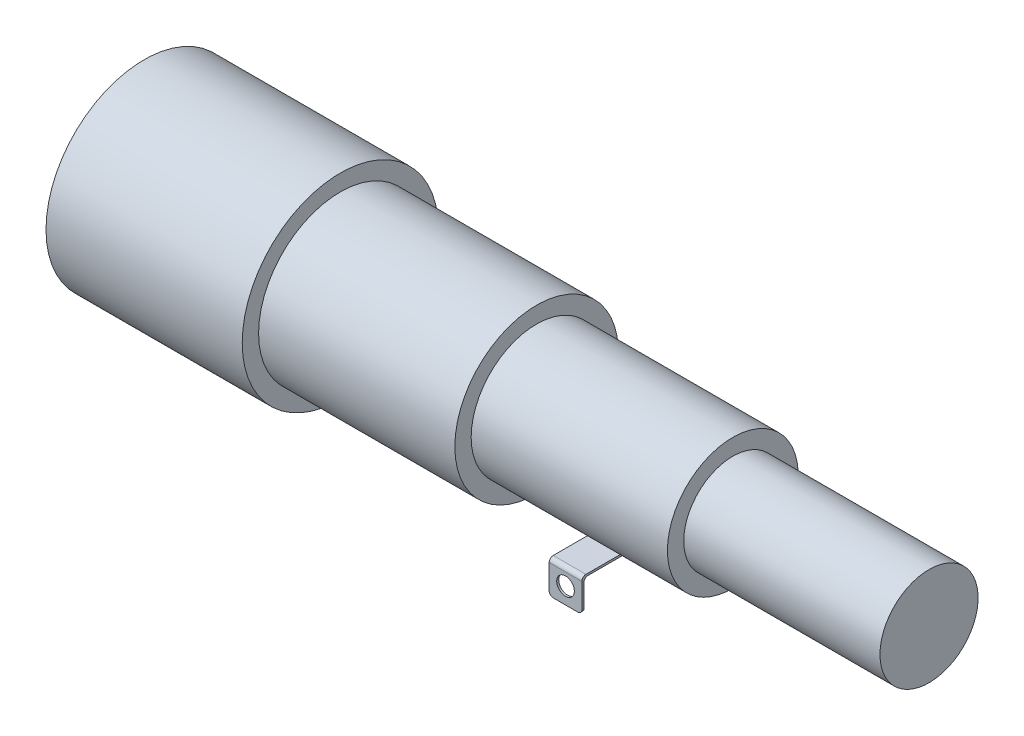
ISO-10303-21;
HEADER;
FILE_DESCRIPTION(('STEP AP214'),'2;1');
FILE_NAME('part.step','',(''),(''),'','','');
FILE_SCHEMA(('AUTOMOTIVE_DESIGN { 1 0 10303 214 1 1 1 1 }'));
ENDSEC;
DATA;
#1=APPLICATION_CONTEXT('core data for automotive mechanical design processes');
#2=APPLICATION_PROTOCOL_DEFINITION('international standard','automotive_design',2000,#1);
#3=PRODUCT_CONTEXT('',#1,'mechanical');
#4=PRODUCT('Part','Part','',(#3));
#5=PRODUCT_RELATED_PRODUCT_CATEGORY('part','',(#4));
#6=PRODUCT_DEFINITION_FORMATION('','',#4);
#7=PRODUCT_DEFINITION_CONTEXT('part definition',#1,'design');
#8=PRODUCT_DEFINITION('design','',#6,#7);
#9=PRODUCT_DEFINITION_SHAPE('','',#8);
#10=(LENGTH_UNIT() NAMED_UNIT(*) SI_UNIT(.MILLI.,.METRE.));
#11=(NAMED_UNIT(*) PLANE_ANGLE_UNIT() SI_UNIT($,.RADIAN.));
#12=(NAMED_UNIT(*) SI_UNIT($,.STERADIAN.) SOLID_ANGLE_UNIT());
#13=UNCERTAINTY_MEASURE_WITH_UNIT(LENGTH_MEASURE(1.E-05),#10,'distance_accuracy_value','');
#14=(GEOMETRIC_REPRESENTATION_CONTEXT(3) GLOBAL_UNCERTAINTY_ASSIGNED_CONTEXT((#13)) GLOBAL_UNIT_ASSIGNED_CONTEXT((#10,
#11,#12)) REPRESENTATION_CONTEXT('',''));
#15=CARTESIAN_POINT('',(0.,0.,0.));
#16=DIRECTION('',(0.,0.,1.));
#17=DIRECTION('',(1.,0.,0.));
#18=AXIS2_PLACEMENT_3D('',#15,#16,#17);
#19=CARTESIAN_POINT('',(730.633019333322,-104.775,98.298));
#20=DIRECTION('',(0.,0.,1.));
#21=DIRECTION('',(0.,-1.,0.));
#22=AXIS2_PLACEMENT_3D('',#19,#20,#21);
#23=PLANE('',#22);
#24=CARTESIAN_POINT('',(756.033019333322,-127.,98.2979999999999));
#25=DIRECTION('',(0.,0.,1.));
#26=DIRECTION('',(0.,-1.,0.));
#27=AXIS2_PLACEMENT_3D('',#24,#25,#26);
#28=CIRCLE('',#27,13.716);
#29=CARTESIAN_POINT('',(756.033019333322,-140.716,98.2979999999999));
#30=VERTEX_POINT('',#29);
#31=EDGE_CURVE('E292',#30,#30,#28,.T.);
#32=ORIENTED_EDGE('',*,*,#31,.T.);
#33=EDGE_LOOP('',(#32));
#34=FACE_BOUND('',#33,.T.);
#35=DIRECTION('',(0.,-1.,0.));
#36=VECTOR('',#35,1.);
#37=CARTESIAN_POINT('',(781.433019333322,-104.775,98.298));
#38=LINE('',#37,#36);
#39=CARTESIAN_POINT('',(781.433019333322,-111.125,98.298));
#40=VERTEX_POINT('',#39);
#41=CARTESIAN_POINT('',(781.433019333322,-146.05,98.2979999999999));
#42=VERTEX_POINT('',#41);
#43=EDGE_CURVE('E269',#40,#42,#38,.T.);
#44=ORIENTED_EDGE('',*,*,#43,.T.);
#45=CARTESIAN_POINT('',(775.083019333322,-146.05,98.2979999999999));
#46=DIRECTION('',(0.,0.,1.));
#47=DIRECTION('',(0.,-1.,0.));
#48=AXIS2_PLACEMENT_3D('',#45,#46,#47);
#49=CIRCLE('',#48,6.35);
#50=CARTESIAN_POINT('',(775.083019333322,-152.4,98.2979999999999));
#51=VERTEX_POINT('',#50);
#52=EDGE_CURVE('E239',#42,#51,#49,.F.);
#53=ORIENTED_EDGE('',*,*,#52,.T.);
#54=DIRECTION('',(1.,0.,0.));
#55=VECTOR('',#54,1.);
#56=CARTESIAN_POINT('',(730.633019333322,-152.4,98.2979999999999));
#57=LINE('',#56,#55);
#58=CARTESIAN_POINT('',(736.983019333322,-152.4,98.2979999999999));
#59=VERTEX_POINT('',#58);
#60=EDGE_CURVE('E199',#59,#51,#57,.T.);
#61=ORIENTED_EDGE('',*,*,#60,.F.);
#62=CARTESIAN_POINT('',(736.983019333322,-146.05,98.2979999999999));
#63=DIRECTION('',(0.,0.,1.));
#64=DIRECTION('',(0.,-1.,0.));
#65=AXIS2_PLACEMENT_3D('',#62,#63,#64);
#66=CIRCLE('',#65,6.35);
#67=CARTESIAN_POINT('',(730.633019333322,-146.05,98.2979999999999));
#68=VERTEX_POINT('',#67);
#69=EDGE_CURVE('E237',#59,#68,#66,.F.);
#70=ORIENTED_EDGE('',*,*,#69,.T.);
#71=DIRECTION('',(0.,-1.,0.));
#72=VECTOR('',#71,1.);
#73=CARTESIAN_POINT('',(730.633019333322,-104.775,98.298));
#74=LINE('',#73,#72);
#75=CARTESIAN_POINT('',(730.633019333322,-111.125,98.298));
#76=VERTEX_POINT('',#75);
#77=EDGE_CURVE('E274',#76,#68,#74,.T.);
#78=ORIENTED_EDGE('',*,*,#77,.F.);
#79=DIRECTION('',(1.,0.,0.));
#80=VECTOR('',#79,1.);
#81=CARTESIAN_POINT('',(781.433019333322,-111.125,98.2979999999999));
#82=LINE('',#81,#80);
#83=EDGE_CURVE('E234',#76,#40,#82,.T.);
#84=ORIENTED_EDGE('',*,*,#83,.T.);
#85=EDGE_LOOP('',(#44,#53,#61,#70,#78,#84));
#86=FACE_BOUND('',#85,.T.);
#87=ADVANCED_FACE('F58',(#34,#86),#23,.F.);
#88=CARTESIAN_POINT('',(730.633019333322,-152.4,98.2979999999999));
#89=DIRECTION('',(0.,1.,0.));
#90=DIRECTION('',(0.,0.,1.));
#91=AXIS2_PLACEMENT_3D('',#88,#89,#90);
#92=PLANE('',#91);
#93=ORIENTED_EDGE('',*,*,#60,.T.);
#94=DIRECTION('',(0.,0.,1.));
#95=VECTOR('',#94,1.);
#96=CARTESIAN_POINT('',(775.083019333322,-152.4,98.2979999999999));
#97=LINE('',#96,#95);
#98=CARTESIAN_POINT('',(775.083019333322,-152.4,101.473));
#99=VERTEX_POINT('',#98);
#100=EDGE_CURVE('E225',#51,#99,#97,.T.);
#101=ORIENTED_EDGE('',*,*,#100,.T.);
#102=DIRECTION('',(1.,0.,0.));
#103=VECTOR('',#102,1.);
#104=CARTESIAN_POINT('',(730.633019333322,-152.4,101.473));
#105=LINE('',#104,#103);
#106=CARTESIAN_POINT('',(736.983019333322,-152.4,101.473));
#107=VERTEX_POINT('',#106);
#108=EDGE_CURVE('E203',#107,#99,#105,.T.);
#109=ORIENTED_EDGE('',*,*,#108,.F.);
#110=DIRECTION('',(0.,0.,1.));
#111=VECTOR('',#110,1.);
#112=CARTESIAN_POINT('',(736.983019333322,-152.4,98.2979999999999));
#113=LINE('',#112,#111);
#114=EDGE_CURVE('E223',#107,#59,#113,.F.);
#115=ORIENTED_EDGE('',*,*,#114,.T.);
#116=EDGE_LOOP('',(#93,#101,#109,#115));
#117=FACE_BOUND('',#116,.T.);
#118=ADVANCED_FACE('F321',(#117),#92,.F.);
#119=CARTESIAN_POINT('',(730.633019333322,-101.6,101.473));
#120=DIRECTION('',(0.,0.,-1.));
#121=DIRECTION('',(0.,1.,0.));
#122=AXIS2_PLACEMENT_3D('',#119,#120,#121);
#123=PLANE('',#122);
#124=CARTESIAN_POINT('',(756.033019333322,-127.,101.473));
#125=DIRECTION('',(0.,0.,-1.));
#126=DIRECTION('',(0.,1.,0.));
#127=AXIS2_PLACEMENT_3D('',#124,#125,#126);
#128=CIRCLE('',#127,13.716);
#129=CARTESIAN_POINT('',(756.033019333322,-113.284,101.473));
#130=VERTEX_POINT('',#129);
#131=EDGE_CURVE('E521',#130,#130,#128,.T.);
#132=ORIENTED_EDGE('',*,*,#131,.T.);
#133=EDGE_LOOP('',(#132));
#134=FACE_BOUND('',#133,.T.);
#135=ORIENTED_EDGE('',*,*,#108,.T.);
#136=CARTESIAN_POINT('',(775.083019333322,-146.05,101.473));
#137=DIRECTION('',(0.,0.,-1.));
#138=DIRECTION('',(0.,1.,0.));
#139=AXIS2_PLACEMENT_3D('',#136,#137,#138);
#140=CIRCLE('',#139,6.35);
#141=CARTESIAN_POINT('',(781.433019333322,-146.05,101.473));
#142=VERTEX_POINT('',#141);
#143=EDGE_CURVE('E232',#99,#142,#140,.F.);
#144=ORIENTED_EDGE('',*,*,#143,.T.);
#145=DIRECTION('',(0.,1.,0.));
#146=VECTOR('',#145,1.);
#147=CARTESIAN_POINT('',(781.433019333322,-101.6,101.473));
#148=LINE('',#147,#146);
#149=CARTESIAN_POINT('',(781.433019333322,-107.95,101.473));
#150=VERTEX_POINT('',#149);
#151=EDGE_CURVE('E302',#142,#150,#148,.T.);
#152=ORIENTED_EDGE('',*,*,#151,.T.);
#153=DIRECTION('',(1.,0.,0.));
#154=VECTOR('',#153,1.);
#155=CARTESIAN_POINT('',(730.633019333322,-107.95,101.473));
#156=LINE('',#155,#154);
#157=CARTESIAN_POINT('',(730.633019333322,-107.95,101.473));
#158=VERTEX_POINT('',#157);
#159=EDGE_CURVE('E228',#150,#158,#156,.F.);
#160=ORIENTED_EDGE('',*,*,#159,.T.);
#161=DIRECTION('',(0.,1.,0.));
#162=VECTOR('',#161,1.);
#163=CARTESIAN_POINT('',(730.633019333322,-101.6,101.473));
#164=LINE('',#163,#162);
#165=CARTESIAN_POINT('',(730.633019333322,-146.05,101.473));
#166=VERTEX_POINT('',#165);
#167=EDGE_CURVE('E286',#166,#158,#164,.T.);
#168=ORIENTED_EDGE('',*,*,#167,.F.);
#169=CARTESIAN_POINT('',(736.983019333322,-146.05,101.473));
#170=DIRECTION('',(0.,0.,-1.));
#171=DIRECTION('',(0.,1.,0.));
#172=AXIS2_PLACEMENT_3D('',#169,#170,#171);
#173=CIRCLE('',#172,6.35);
#174=EDGE_CURVE('E230',#166,#107,#173,.F.);
#175=ORIENTED_EDGE('',*,*,#174,.T.);
#176=EDGE_LOOP('',(#135,#144,#152,#160,#168,#175));
#177=FACE_BOUND('',#176,.T.);
#178=ADVANCED_FACE('F316',(#134,#177),#123,.F.);
#179=CARTESIAN_POINT('',(730.633019333322,-101.6,101.473));
#180=DIRECTION('',(0.,-1.,0.));
#181=DIRECTION('',(0.,0.,-1.));
#182=AXIS2_PLACEMENT_3D('',#179,#180,#181);
#183=PLANE('',#182);
#184=DIRECTION('',(0.,0.,-1.));
#185=VECTOR('',#184,1.);
#186=CARTESIAN_POINT('',(781.433019333322,-101.6,101.473));
#187=LINE('',#186,#185);
#188=CARTESIAN_POINT('',(781.433019333322,-101.6,95.1229999999999));
#189=VERTEX_POINT('',#188);
#190=CARTESIAN_POINT('',(781.433019333322,-101.6,-95.1230000000001));
#191=VERTEX_POINT('',#190);
#192=EDGE_CURVE('E305',#189,#191,#187,.T.);
#193=ORIENTED_EDGE('',*,*,#192,.T.);
#194=DIRECTION('',(1.,0.,0.));
#195=VECTOR('',#194,1.);
#196=CARTESIAN_POINT('',(730.633019333322,-101.6,-95.1230000000001));
#197=LINE('',#196,#195);
#198=CARTESIAN_POINT('',(730.633019333322,-101.6,-95.1230000000001));
#199=VERTEX_POINT('',#198);
#200=EDGE_CURVE('E257',#191,#199,#197,.F.);
#201=ORIENTED_EDGE('',*,*,#200,.T.);
#202=DIRECTION('',(0.,0.,-1.));
#203=VECTOR('',#202,1.);
#204=CARTESIAN_POINT('',(730.633019333322,-101.6,101.473));
#205=LINE('',#204,#203);
#206=CARTESIAN_POINT('',(730.633019333322,-101.6,95.1229999999999));
#207=VERTEX_POINT('',#206);
#208=EDGE_CURVE('E289',#207,#199,#205,.T.);
#209=ORIENTED_EDGE('',*,*,#208,.F.);
#210=DIRECTION('',(1.,0.,0.));
#211=VECTOR('',#210,1.);
#212=CARTESIAN_POINT('',(730.633019333322,-101.6,95.1229999999999));
#213=LINE('',#212,#211);
#214=EDGE_CURVE('E254',#207,#189,#213,.T.);
#215=ORIENTED_EDGE('',*,*,#214,.T.);
#216=EDGE_LOOP('',(#193,#201,#209,#215));
#217=FACE_BOUND('',#216,.T.);
#218=ADVANCED_FACE('F333',(#217),#183,.F.);
#219=CARTESIAN_POINT('',(730.633019333322,-101.6,-101.473));
#220=DIRECTION('',(0.,0.,1.));
#221=DIRECTION('',(1.,0.,0.));
#222=AXIS2_PLACEMENT_3D('',#219,#220,#221);
#223=PLANE('',#222);
#224=CARTESIAN_POINT('',(756.033019333322,-127.,-101.473));
#225=DIRECTION('',(0.,0.,1.));
#226=DIRECTION('',(1.,0.,0.));
#227=AXIS2_PLACEMENT_3D('',#224,#225,#226);
#228=CIRCLE('',#227,13.716);
#229=CARTESIAN_POINT('',(769.749019333322,-127.,-101.473));
#230=VERTEX_POINT('',#229);
#231=EDGE_CURVE('E523',#230,#230,#228,.T.);
#232=ORIENTED_EDGE('',*,*,#231,.T.);
#233=EDGE_LOOP('',(#232));
#234=FACE_BOUND('',#233,.T.);
#235=DIRECTION('',(0.,-1.,0.));
#236=VECTOR('',#235,1.);
#237=CARTESIAN_POINT('',(781.433019333322,-101.6,-101.473));
#238=LINE('',#237,#236);
#239=CARTESIAN_POINT('',(781.433019333322,-107.95,-101.473));
#240=VERTEX_POINT('',#239);
#241=CARTESIAN_POINT('',(781.433019333322,-146.05,-101.473));
#242=VERTEX_POINT('',#241);
#243=EDGE_CURVE('E308',#240,#242,#238,.T.);
#244=ORIENTED_EDGE('',*,*,#243,.T.);
#245=CARTESIAN_POINT('',(775.083019333322,-146.05,-101.473));
#246=DIRECTION('',(0.,0.,1.));
#247=DIRECTION('',(1.,0.,0.));
#248=AXIS2_PLACEMENT_3D('',#245,#246,#247);
#249=CIRCLE('',#248,6.35);
#250=CARTESIAN_POINT('',(775.083019333322,-152.4,-101.473));
#251=VERTEX_POINT('',#250);
#252=EDGE_CURVE('E221',#242,#251,#249,.F.);
#253=ORIENTED_EDGE('',*,*,#252,.T.);
#254=DIRECTION('',(1.,0.,0.));
#255=VECTOR('',#254,1.);
#256=CARTESIAN_POINT('',(730.633019333322,-152.4,-101.473));
#257=LINE('',#256,#255);
#258=CARTESIAN_POINT('',(736.983019333322,-152.4,-101.473));
#259=VERTEX_POINT('',#258);
#260=EDGE_CURVE('E193',#259,#251,#257,.T.);
#261=ORIENTED_EDGE('',*,*,#260,.F.);
#262=CARTESIAN_POINT('',(736.983019333322,-146.05,-101.473));
#263=DIRECTION('',(0.,0.,1.));
#264=DIRECTION('',(1.,0.,0.));
#265=AXIS2_PLACEMENT_3D('',#262,#263,#264);
#266=CIRCLE('',#265,6.35);
#267=CARTESIAN_POINT('',(730.633019333322,-146.05,-101.473));
#268=VERTEX_POINT('',#267);
#269=EDGE_CURVE('E198',#259,#268,#266,.F.);
#270=ORIENTED_EDGE('',*,*,#269,.T.);
#271=DIRECTION('',(0.,-1.,0.));
#272=VECTOR('',#271,1.);
#273=CARTESIAN_POINT('',(730.633019333322,-101.6,-101.473));
#274=LINE('',#273,#272);
#275=CARTESIAN_POINT('',(730.633019333322,-107.95,-101.473));
#276=VERTEX_POINT('',#275);
#277=EDGE_CURVE('E297',#276,#268,#274,.T.);
#278=ORIENTED_EDGE('',*,*,#277,.F.);
#279=DIRECTION('',(1.,0.,0.));
#280=VECTOR('',#279,1.);
#281=CARTESIAN_POINT('',(730.633019333322,-107.95,-101.473));
#282=LINE('',#281,#280);
#283=EDGE_CURVE('E217',#276,#240,#282,.T.);
#284=ORIENTED_EDGE('',*,*,#283,.T.);
#285=EDGE_LOOP('',(#244,#253,#261,#270,#278,#284));
#286=FACE_BOUND('',#285,.T.);
#287=ADVANCED_FACE('F341',(#234,#286),#223,.F.);
#288=CARTESIAN_POINT('',(730.633019333322,-152.4,-98.2980000000001));
#289=DIRECTION('',(0.,1.,0.));
#290=DIRECTION('',(0.,0.,1.));
#291=AXIS2_PLACEMENT_3D('',#288,#289,#290);
#292=PLANE('',#291);
#293=ORIENTED_EDGE('',*,*,#260,.T.);
#294=DIRECTION('',(0.,0.,1.));
#295=VECTOR('',#294,1.);
#296=CARTESIAN_POINT('',(775.083019333322,-152.4,-98.2980000000001));
#297=LINE('',#296,#295);
#298=CARTESIAN_POINT('',(775.083019333322,-152.4,-98.2980000000001));
#299=VERTEX_POINT('',#298);
#300=EDGE_CURVE('E192',#251,#299,#297,.T.);
#301=ORIENTED_EDGE('',*,*,#300,.T.);
#302=DIRECTION('',(1.,0.,0.));
#303=VECTOR('',#302,1.);
#304=CARTESIAN_POINT('',(730.633019333322,-152.4,-98.2980000000001));
#305=LINE('',#304,#303);
#306=CARTESIAN_POINT('',(736.983019333322,-152.4,-98.2980000000001));
#307=VERTEX_POINT('',#306);
#308=EDGE_CURVE('E176',#307,#299,#305,.T.);
#309=ORIENTED_EDGE('',*,*,#308,.F.);
#310=DIRECTION('',(0.,0.,1.));
#311=VECTOR('',#310,1.);
#312=CARTESIAN_POINT('',(736.983019333322,-152.4,-101.473));
#313=LINE('',#312,#311);
#314=EDGE_CURVE('E189',#307,#259,#313,.F.);
#315=ORIENTED_EDGE('',*,*,#314,.T.);
#316=EDGE_LOOP('',(#293,#301,#309,#315));
#317=FACE_BOUND('',#316,.T.);
#318=ADVANCED_FACE('F188',(#317),#292,.F.);
#319=CARTESIAN_POINT('',(730.633019333322,-104.775,-98.2980000000001));
#320=DIRECTION('',(0.,0.,-1.));
#321=DIRECTION('',(-1.,0.,0.));
#322=AXIS2_PLACEMENT_3D('',#319,#320,#321);
#323=PLANE('',#322);
#324=CARTESIAN_POINT('',(756.033019333322,-127.,-98.2980000000001));
#325=DIRECTION('',(0.,0.,-1.));
#326=DIRECTION('',(-1.,0.,0.));
#327=AXIS2_PLACEMENT_3D('',#324,#325,#326);
#328=CIRCLE('',#327,13.716);
#329=CARTESIAN_POINT('',(742.317019333322,-127.,-98.2980000000001));
#330=VERTEX_POINT('',#329);
#331=EDGE_CURVE('E62',#330,#330,#328,.T.);
#332=ORIENTED_EDGE('',*,*,#331,.T.);
#333=EDGE_LOOP('',(#332));
#334=FACE_BOUND('',#333,.T.);
#335=ORIENTED_EDGE('',*,*,#308,.T.);
#336=CARTESIAN_POINT('',(775.083019333322,-146.05,-98.2980000000001));
#337=DIRECTION('',(0.,0.,-1.));
#338=DIRECTION('',(-1.,0.,0.));
#339=AXIS2_PLACEMENT_3D('',#336,#337,#338);
#340=CIRCLE('',#339,6.35);
#341=CARTESIAN_POINT('',(781.433019333322,-146.05,-98.2980000000001));
#342=VERTEX_POINT('',#341);
#343=EDGE_CURVE('E182',#299,#342,#340,.F.);
#344=ORIENTED_EDGE('',*,*,#343,.T.);
#345=DIRECTION('',(0.,1.,0.));
#346=VECTOR('',#345,1.);
#347=CARTESIAN_POINT('',(781.433019333322,-104.775,-98.2980000000001));
#348=LINE('',#347,#346);
#349=CARTESIAN_POINT('',(781.433019333322,-111.125,-98.2980000000001));
#350=VERTEX_POINT('',#349);
#351=EDGE_CURVE('E275',#342,#350,#348,.T.);
#352=ORIENTED_EDGE('',*,*,#351,.T.);
#353=DIRECTION('',(1.,0.,0.));
#354=VECTOR('',#353,1.);
#355=CARTESIAN_POINT('',(730.633019333322,-111.125,-98.2980000000001));
#356=LINE('',#355,#354);
#357=CARTESIAN_POINT('',(730.633019333322,-111.125,-98.2980000000001));
#358=VERTEX_POINT('',#357);
#359=EDGE_CURVE('E183',#350,#358,#356,.F.);
#360=ORIENTED_EDGE('',*,*,#359,.T.);
#361=DIRECTION('',(0.,1.,0.));
#362=VECTOR('',#361,1.);
#363=CARTESIAN_POINT('',(730.633019333322,-104.775,-98.2980000000001));
#364=LINE('',#363,#362);
#365=CARTESIAN_POINT('',(730.633019333322,-146.05,-98.2980000000001));
#366=VERTEX_POINT('',#365);
#367=EDGE_CURVE('E177',#366,#358,#364,.T.);
#368=ORIENTED_EDGE('',*,*,#367,.F.);
#369=CARTESIAN_POINT('',(736.983019333322,-146.05,-98.2980000000001));
#370=DIRECTION('',(0.,0.,-1.));
#371=DIRECTION('',(-1.,0.,0.));
#372=AXIS2_PLACEMENT_3D('',#369,#370,#371);
#373=CIRCLE('',#372,6.35);
#374=EDGE_CURVE('E173',#366,#307,#373,.F.);
#375=ORIENTED_EDGE('',*,*,#374,.T.);
#376=EDGE_LOOP('',(#335,#344,#352,#360,#368,#375));
#377=FACE_BOUND('',#376,.T.);
#378=ADVANCED_FACE('F175',(#334,#377),#323,.F.);
#379=CARTESIAN_POINT('',(730.633019333322,-104.775,98.298));
#380=DIRECTION('',(0.,1.,0.));
#381=DIRECTION('',(0.,0.,1.));
#382=AXIS2_PLACEMENT_3D('',#379,#380,#381);
#383=PLANE('',#382);
#384=DIRECTION('',(0.,0.,1.));
#385=VECTOR('',#384,1.);
#386=CARTESIAN_POINT('',(730.633019333322,-104.775,98.298));
#387=LINE('',#386,#385);
#388=CARTESIAN_POINT('',(730.633019333322,-104.775,-91.9480000000001));
#389=VERTEX_POINT('',#388);
#390=CARTESIAN_POINT('',(730.633019333322,-104.775,91.948));
#391=VERTEX_POINT('',#390);
#392=EDGE_CURVE('E194',#389,#391,#387,.T.);
#393=ORIENTED_EDGE('',*,*,#392,.F.);
#394=DIRECTION('',(1.,0.,0.));
#395=VECTOR('',#394,1.);
#396=CARTESIAN_POINT('',(781.433019333322,-104.775,-91.9480000000001));
#397=LINE('',#396,#395);
#398=CARTESIAN_POINT('',(781.433019333322,-104.775,-91.9480000000001));
#399=VERTEX_POINT('',#398);
#400=EDGE_CURVE('E251',#389,#399,#397,.T.);
#401=ORIENTED_EDGE('',*,*,#400,.T.);
#402=DIRECTION('',(0.,0.,1.));
#403=VECTOR('',#402,1.);
#404=CARTESIAN_POINT('',(781.433019333322,-104.775,98.298));
#405=LINE('',#404,#403);
#406=CARTESIAN_POINT('',(781.433019333322,-104.775,91.948));
#407=VERTEX_POINT('',#406);
#408=EDGE_CURVE('E267',#399,#407,#405,.T.);
#409=ORIENTED_EDGE('',*,*,#408,.T.);
#410=DIRECTION('',(1.,0.,0.));
#411=VECTOR('',#410,1.);
#412=CARTESIAN_POINT('',(730.633019333322,-104.775,91.948));
#413=LINE('',#412,#411);
#414=EDGE_CURVE('E74',#407,#391,#413,.F.);
#415=ORIENTED_EDGE('',*,*,#414,.T.);
#416=EDGE_LOOP('',(#393,#401,#409,#415));
#417=FACE_BOUND('',#416,.T.);
#418=ADVANCED_FACE('F272',(#417),#383,.F.);
#419=CARTESIAN_POINT('',(730.633019333322,0.,0.));
#420=DIRECTION('',(-1.,0.,0.));
#421=DIRECTION('',(0.,0.,1.));
#422=AXIS2_PLACEMENT_3D('',#419,#420,#421);
#423=PLANE('',#422);
#424=ORIENTED_EDGE('',*,*,#277,.T.);
#425=DIRECTION('',(0.,0.,1.));
#426=VECTOR('',#425,1.);
#427=CARTESIAN_POINT('',(730.633019333322,-146.05,-98.2980000000001));
#428=LINE('',#427,#426);
#429=EDGE_CURVE('E248',#268,#366,#428,.T.);
#430=ORIENTED_EDGE('',*,*,#429,.T.);
#431=ORIENTED_EDGE('',*,*,#367,.T.);
#432=CARTESIAN_POINT('',(730.633019333322,-111.125,-91.9480000000001));
#433=DIRECTION('',(-1.,0.,0.));
#434=DIRECTION('',(0.,0.,1.));
#435=AXIS2_PLACEMENT_3D('',#432,#433,#434);
#436=CIRCLE('',#435,6.35);
#437=EDGE_CURVE('E81',#358,#389,#436,.F.);
#438=ORIENTED_EDGE('',*,*,#437,.T.);
#439=ORIENTED_EDGE('',*,*,#392,.T.);
#440=CARTESIAN_POINT('',(730.633019333322,-111.125,91.948));
#441=DIRECTION('',(-1.,0.,0.));
#442=DIRECTION('',(0.,0.,1.));
#443=AXIS2_PLACEMENT_3D('',#440,#441,#442);
#444=CIRCLE('',#443,6.35);
#445=EDGE_CURVE('E14',#391,#76,#444,.F.);
#446=ORIENTED_EDGE('',*,*,#445,.T.);
#447=ORIENTED_EDGE('',*,*,#77,.T.);
#448=DIRECTION('',(0.,0.,1.));
#449=VECTOR('',#448,1.);
#450=CARTESIAN_POINT('',(730.633019333322,-146.05,101.473));
#451=LINE('',#450,#449);
#452=EDGE_CURVE('E245',#68,#166,#451,.T.);
#453=ORIENTED_EDGE('',*,*,#452,.T.);
#454=ORIENTED_EDGE('',*,*,#167,.T.);
#455=CARTESIAN_POINT('',(730.633019333322,-107.95,95.1229999999999));
#456=DIRECTION('',(-1.,0.,0.));
#457=DIRECTION('',(0.,0.,1.));
#458=AXIS2_PLACEMENT_3D('',#455,#456,#457);
#459=CIRCLE('',#458,6.35);
#460=EDGE_CURVE('E241',#158,#207,#459,.T.);
#461=ORIENTED_EDGE('',*,*,#460,.T.);
#462=ORIENTED_EDGE('',*,*,#208,.T.);
#463=CARTESIAN_POINT('',(730.633019333322,-107.95,-95.1230000000001));
#464=DIRECTION('',(-1.,0.,0.));
#465=DIRECTION('',(0.,0.,1.));
#466=AXIS2_PLACEMENT_3D('',#463,#464,#465);
#467=CIRCLE('',#466,6.35);
#468=EDGE_CURVE('E243',#199,#276,#467,.T.);
#469=ORIENTED_EDGE('',*,*,#468,.T.);
#470=EDGE_LOOP('',(#424,#430,#431,#438,#439,#446,#447,#453,#454,#461,#462,#469));
#471=FACE_BOUND('',#470,.T.);
#472=ADVANCED_FACE('F281',(#471),#423,.T.);
#473=CARTESIAN_POINT('',(781.433019333322,0.,0.));
#474=DIRECTION('',(-1.,0.,0.));
#475=DIRECTION('',(0.,0.,1.));
#476=AXIS2_PLACEMENT_3D('',#473,#474,#475);
#477=PLANE('',#476);
#478=ORIENTED_EDGE('',*,*,#351,.F.);
#479=DIRECTION('',(0.,0.,1.));
#480=VECTOR('',#479,1.);
#481=CARTESIAN_POINT('',(781.433019333322,-146.049999999999,1.27364587544909E-12));
#482=LINE('',#481,#480);
#483=EDGE_CURVE('E215',#342,#242,#482,.F.);
#484=ORIENTED_EDGE('',*,*,#483,.T.);
#485=ORIENTED_EDGE('',*,*,#243,.F.);
#486=CARTESIAN_POINT('',(781.433019333322,-107.95,-95.1230000000001));
#487=DIRECTION('',(-1.,0.,0.));
#488=DIRECTION('',(0.,0.,1.));
#489=AXIS2_PLACEMENT_3D('',#486,#487,#488);
#490=CIRCLE('',#489,6.35);
#491=EDGE_CURVE('E211',#240,#191,#490,.F.);
#492=ORIENTED_EDGE('',*,*,#491,.T.);
#493=ORIENTED_EDGE('',*,*,#192,.F.);
#494=CARTESIAN_POINT('',(781.433019333322,-107.95,95.1229999999999));
#495=DIRECTION('',(-1.,0.,0.));
#496=DIRECTION('',(0.,0.,1.));
#497=AXIS2_PLACEMENT_3D('',#494,#495,#496);
#498=CIRCLE('',#497,6.35);
#499=EDGE_CURVE('E209',#189,#150,#498,.F.);
#500=ORIENTED_EDGE('',*,*,#499,.T.);
#501=ORIENTED_EDGE('',*,*,#151,.F.);
#502=DIRECTION('',(0.,0.,1.));
#503=VECTOR('',#502,1.);
#504=CARTESIAN_POINT('',(781.433019333322,-146.05,0.));
#505=LINE('',#504,#503);
#506=EDGE_CURVE('E213',#142,#42,#505,.F.);
#507=ORIENTED_EDGE('',*,*,#506,.T.);
#508=ORIENTED_EDGE('',*,*,#43,.F.);
#509=CARTESIAN_POINT('',(781.433019333322,-111.125,91.948));
#510=DIRECTION('',(-1.,0.,0.));
#511=DIRECTION('',(0.,0.,1.));
#512=AXIS2_PLACEMENT_3D('',#509,#510,#511);
#513=CIRCLE('',#512,6.35);
#514=EDGE_CURVE('E67',#40,#407,#513,.T.);
#515=ORIENTED_EDGE('',*,*,#514,.T.);
#516=ORIENTED_EDGE('',*,*,#408,.F.);
#517=CARTESIAN_POINT('',(781.433019333322,-111.125,-91.9480000000001));
#518=DIRECTION('',(-1.,0.,0.));
#519=DIRECTION('',(0.,0.,1.));
#520=AXIS2_PLACEMENT_3D('',#517,#518,#519);
#521=CIRCLE('',#520,6.35);
#522=EDGE_CURVE('E259',#399,#350,#521,.T.);
#523=ORIENTED_EDGE('',*,*,#522,.T.);
#524=EDGE_LOOP('',(#478,#484,#485,#492,#493,#500,#501,#507,#508,#515,#516,#523));
#525=FACE_BOUND('',#524,.T.);
#526=ADVANCED_FACE('F266',(#525),#477,.F.);
#527=CARTESIAN_POINT('',(775.083019333322,-146.05,-98.2980000000001));
#528=DIRECTION('',(0.,0.,1.));
#529=DIRECTION('',(0.,-1.,0.));
#530=AXIS2_PLACEMENT_3D('',#527,#528,#529);
#531=CYLINDRICAL_SURFACE('',#530,6.35);
#532=ORIENTED_EDGE('',*,*,#252,.F.);
#533=ORIENTED_EDGE('',*,*,#483,.F.);
#534=ORIENTED_EDGE('',*,*,#343,.F.);
#535=ORIENTED_EDGE('',*,*,#300,.F.);
#536=EDGE_LOOP('',(#532,#533,#534,#535));
#537=FACE_BOUND('',#536,.T.);
#538=ADVANCED_FACE('F345',(#537),#531,.T.);
#539=CARTESIAN_POINT('',(775.083019333322,-146.05,98.2979999999999));
#540=DIRECTION('',(0.,0.,1.));
#541=DIRECTION('',(1.,0.,0.));
#542=AXIS2_PLACEMENT_3D('',#539,#540,#541);
#543=CYLINDRICAL_SURFACE('',#542,6.35);
#544=ORIENTED_EDGE('',*,*,#52,.F.);
#545=ORIENTED_EDGE('',*,*,#506,.F.);
#546=ORIENTED_EDGE('',*,*,#143,.F.);
#547=ORIENTED_EDGE('',*,*,#100,.F.);
#548=EDGE_LOOP('',(#544,#545,#546,#547));
#549=FACE_BOUND('',#548,.T.);
#550=ADVANCED_FACE('F370',(#549),#543,.T.);
#551=CARTESIAN_POINT('',(736.983019333322,-146.049999999999,1.27986708118876E-12));
#552=DIRECTION('',(0.,0.,-1.));
#553=DIRECTION('',(0.,1.,0.));
#554=AXIS2_PLACEMENT_3D('',#551,#552,#553);
#555=CYLINDRICAL_SURFACE('',#554,6.35);
#556=ORIENTED_EDGE('',*,*,#269,.F.);
#557=ORIENTED_EDGE('',*,*,#314,.F.);
#558=ORIENTED_EDGE('',*,*,#374,.F.);
#559=ORIENTED_EDGE('',*,*,#429,.F.);
#560=EDGE_LOOP('',(#556,#557,#558,#559));
#561=FACE_BOUND('',#560,.T.);
#562=ADVANCED_FACE('F197',(#561),#555,.T.);
#563=CARTESIAN_POINT('',(736.983019333322,-146.05,0.));
#564=DIRECTION('',(0.,0.,-1.));
#565=DIRECTION('',(-1.,0.,0.));
#566=AXIS2_PLACEMENT_3D('',#563,#564,#565);
#567=CYLINDRICAL_SURFACE('',#566,6.35);
#568=ORIENTED_EDGE('',*,*,#69,.F.);
#569=ORIENTED_EDGE('',*,*,#114,.F.);
#570=ORIENTED_EDGE('',*,*,#174,.F.);
#571=ORIENTED_EDGE('',*,*,#452,.F.);
#572=EDGE_LOOP('',(#568,#569,#570,#571));
#573=FACE_BOUND('',#572,.T.);
#574=ADVANCED_FACE('F324',(#573),#567,.T.);
#575=CARTESIAN_POINT('',(730.633019333322,-111.125,-91.9480000000001));
#576=DIRECTION('',(-1.,0.,0.));
#577=DIRECTION('',(0.,0.,1.));
#578=AXIS2_PLACEMENT_3D('',#575,#576,#577);
#579=CYLINDRICAL_SURFACE('',#578,6.35);
#580=ORIENTED_EDGE('',*,*,#437,.F.);
#581=ORIENTED_EDGE('',*,*,#359,.F.);
#582=ORIENTED_EDGE('',*,*,#522,.F.);
#583=ORIENTED_EDGE('',*,*,#400,.F.);
#584=EDGE_LOOP('',(#580,#581,#582,#583));
#585=FACE_BOUND('',#584,.T.);
#586=ADVANCED_FACE('F349',(#585),#579,.F.);
#587=CARTESIAN_POINT('',(730.633019333322,-107.95,-95.1230000000001));
#588=DIRECTION('',(1.,0.,0.));
#589=DIRECTION('',(0.,0.,-1.));
#590=AXIS2_PLACEMENT_3D('',#587,#588,#589);
#591=CYLINDRICAL_SURFACE('',#590,6.35);
#592=ORIENTED_EDGE('',*,*,#468,.F.);
#593=ORIENTED_EDGE('',*,*,#200,.F.);
#594=ORIENTED_EDGE('',*,*,#491,.F.);
#595=ORIENTED_EDGE('',*,*,#283,.F.);
#596=EDGE_LOOP('',(#592,#593,#594,#595));
#597=FACE_BOUND('',#596,.T.);
#598=ADVANCED_FACE('F337',(#597),#591,.T.);
#599=CARTESIAN_POINT('',(730.633019333322,-107.95,95.1229999999999));
#600=DIRECTION('',(1.,0.,0.));
#601=DIRECTION('',(0.,0.,-1.));
#602=AXIS2_PLACEMENT_3D('',#599,#600,#601);
#603=CYLINDRICAL_SURFACE('',#602,6.35);
#604=ORIENTED_EDGE('',*,*,#460,.F.);
#605=ORIENTED_EDGE('',*,*,#159,.F.);
#606=ORIENTED_EDGE('',*,*,#499,.F.);
#607=ORIENTED_EDGE('',*,*,#214,.F.);
#608=EDGE_LOOP('',(#604,#605,#606,#607));
#609=FACE_BOUND('',#608,.T.);
#610=ADVANCED_FACE('F328',(#609),#603,.T.);
#611=CARTESIAN_POINT('',(730.633019333322,-111.125,91.948));
#612=DIRECTION('',(-1.,0.,0.));
#613=DIRECTION('',(0.,0.,1.));
#614=AXIS2_PLACEMENT_3D('',#611,#612,#613);
#615=CYLINDRICAL_SURFACE('',#614,6.35);
#616=ORIENTED_EDGE('',*,*,#445,.F.);
#617=ORIENTED_EDGE('',*,*,#414,.F.);
#618=ORIENTED_EDGE('',*,*,#514,.F.);
#619=ORIENTED_EDGE('',*,*,#83,.F.);
#620=EDGE_LOOP('',(#616,#617,#618,#619));
#621=FACE_BOUND('',#620,.T.);
#622=ADVANCED_FACE('F60',(#621),#615,.F.);
#623=CARTESIAN_POINT('',(756.033019333322,-127.,-152.4));
#624=DIRECTION('',(0.,0.,1.));
#625=DIRECTION('',(1.,0.,0.));
#626=AXIS2_PLACEMENT_3D('',#623,#624,#625);
#627=CYLINDRICAL_SURFACE('',#626,13.716);
#628=ORIENTED_EDGE('',*,*,#331,.F.);
#629=EDGE_LOOP('',(#628));
#630=FACE_BOUND('',#629,.T.);
#631=ORIENTED_EDGE('',*,*,#231,.F.);
#632=EDGE_LOOP('',(#631));
#633=FACE_BOUND('',#632,.T.);
#634=ADVANCED_FACE('F408',(#630,#633),#627,.F.);
#635=ORIENTED_EDGE('',*,*,#131,.F.);
#636=EDGE_LOOP('',(#635));
#637=FACE_BOUND('',#636,.T.);
#638=ORIENTED_EDGE('',*,*,#31,.F.);
#639=EDGE_LOOP('',(#638));
#640=FACE_BOUND('',#639,.T.);
#641=ADVANCED_FACE('F454',(#637,#640),#627,.F.);
#642=CLOSED_SHELL('',(#87,#118,#178,#218,#287,#318,#378,#418,#472,#526,#538,#550,#562,#574,#586,
#598,#610,#622,#634,#641));
#643=MANIFOLD_SOLID_BREP('B2',#642);
#644=CARTESIAN_POINT('',(304.8,0.,0.));
#645=DIRECTION('',(-1.,0.,0.));
#646=DIRECTION('',(0.,0.,1.));
#647=AXIS2_PLACEMENT_3D('',#644,#645,#646);
#648=CYLINDRICAL_SURFACE('',#647,152.4);
#649=CARTESIAN_POINT('',(304.8,0.,0.));
#650=DIRECTION('',(1.,0.,0.));
#651=DIRECTION('',(0.,0.,-1.));
#652=AXIS2_PLACEMENT_3D('',#649,#650,#651);
#653=CIRCLE('',#652,152.4);
#654=CARTESIAN_POINT('',(304.8,0.,152.4));
#655=VERTEX_POINT('',#654);
#656=EDGE_CURVE('E564',#655,#655,#653,.T.);
#657=CARTESIAN_POINT('',(0.,0.,0.));
#658=DIRECTION('',(1.,0.,0.));
#659=DIRECTION('',(0.,0.,-1.));
#660=AXIS2_PLACEMENT_3D('',#657,#658,#659);
#661=CIRCLE('',#660,152.4);
#662=CARTESIAN_POINT('',(0.,0.,152.4));
#663=VERTEX_POINT('',#662);
#664=EDGE_CURVE('E543',#663,#663,#661,.T.);
#665=CARTESIAN_POINT('',(304.8,0.,152.4));
#666=CARTESIAN_POINT('',(301.625,0.,152.4));
#667=CARTESIAN_POINT('',(298.45,0.,152.4));
#668=CARTESIAN_POINT('',(292.1,0.,152.4));
#669=CARTESIAN_POINT('',(288.925,0.,152.4));
#670=CARTESIAN_POINT('',(282.575,0.,152.4));
#671=CARTESIAN_POINT('',(279.4,0.,152.4));
#672=CARTESIAN_POINT('',(273.05,0.,152.4));
#673=CARTESIAN_POINT('',(269.875,0.,152.4));
#674=CARTESIAN_POINT('',(263.525,0.,152.4));
#675=CARTESIAN_POINT('',(260.35,0.,152.4));
#676=CARTESIAN_POINT('',(254.,0.,152.4));
#677=CARTESIAN_POINT('',(250.825,0.,152.4));
#678=CARTESIAN_POINT('',(244.475,0.,152.4));
#679=CARTESIAN_POINT('',(241.3,0.,152.4));
#680=CARTESIAN_POINT('',(234.95,0.,152.4));
#681=CARTESIAN_POINT('',(231.775,0.,152.4));
#682=CARTESIAN_POINT('',(225.425,0.,152.4));
#683=CARTESIAN_POINT('',(222.25,0.,152.4));
#684=CARTESIAN_POINT('',(215.9,0.,152.4));
#685=CARTESIAN_POINT('',(212.725,0.,152.4));
#686=CARTESIAN_POINT('',(206.375,0.,152.4));
#687=CARTESIAN_POINT('',(203.2,0.,152.4));
#688=CARTESIAN_POINT('',(196.85,0.,152.4));
#689=CARTESIAN_POINT('',(193.675,0.,152.4));
#690=CARTESIAN_POINT('',(187.325,0.,152.4));
#691=CARTESIAN_POINT('',(184.15,0.,152.4));
#692=CARTESIAN_POINT('',(177.8,0.,152.4));
#693=CARTESIAN_POINT('',(174.625,0.,152.4));
#694=CARTESIAN_POINT('',(168.275,0.,152.4));
#695=CARTESIAN_POINT('',(165.1,0.,152.4));
#696=CARTESIAN_POINT('',(158.75,0.,152.4));
#697=CARTESIAN_POINT('',(155.575,0.,152.4));
#698=CARTESIAN_POINT('',(149.225,0.,152.4));
#699=CARTESIAN_POINT('',(146.05,0.,152.4));
#700=CARTESIAN_POINT('',(139.7,0.,152.4));
#701=CARTESIAN_POINT('',(136.525,0.,152.4));
#702=CARTESIAN_POINT('',(130.175,0.,152.4));
#703=CARTESIAN_POINT('',(127.,0.,152.4));
#704=CARTESIAN_POINT('',(120.65,0.,152.4));
#705=CARTESIAN_POINT('',(117.475,0.,152.4));
#706=CARTESIAN_POINT('',(111.125,0.,152.4));
#707=CARTESIAN_POINT('',(107.95,0.,152.4));
#708=CARTESIAN_POINT('',(101.6,0.,152.4));
#709=CARTESIAN_POINT('',(98.425,0.,152.4));
#710=CARTESIAN_POINT('',(92.075,0.,152.4));
#711=CARTESIAN_POINT('',(88.9,0.,152.4));
#712=CARTESIAN_POINT('',(82.55,0.,152.4));
#713=CARTESIAN_POINT('',(79.375,0.,152.4));
#714=CARTESIAN_POINT('',(73.025,0.,152.4));
#715=CARTESIAN_POINT('',(69.85,0.,152.4));
#716=CARTESIAN_POINT('',(63.5,0.,152.4));
#717=CARTESIAN_POINT('',(60.325,0.,152.4));
#718=CARTESIAN_POINT('',(53.975,0.,152.4));
#719=CARTESIAN_POINT('',(50.8,0.,152.4));
#720=CARTESIAN_POINT('',(44.45,0.,152.4));
#721=CARTESIAN_POINT('',(41.275,0.,152.4));
#722=CARTESIAN_POINT('',(34.925,0.,152.4));
#723=CARTESIAN_POINT('',(31.75,0.,152.4));
#724=CARTESIAN_POINT('',(25.4,0.,152.4));
#725=CARTESIAN_POINT('',(22.225,0.,152.4));
#726=CARTESIAN_POINT('',(15.875,0.,152.4));
#727=CARTESIAN_POINT('',(12.7,0.,152.4));
#728=CARTESIAN_POINT('',(6.35,0.,152.4));
#729=CARTESIAN_POINT('',(3.175,0.,152.4));
#730=CARTESIAN_POINT('',(0.,0.,152.4));
#731=B_SPLINE_CURVE_WITH_KNOTS('',3,(#665,#666,#667,#668,#669,#670,#671,#672,#673,#674,#675,
#676,#677,#678,#679,#680,#681,#682,#683,#684,#685,#686,#687,#688,#689,#690,#691,#692,#693,#694,
#695,#696,#697,#698,#699,#700,#701,#702,#703,#704,#705,#706,#707,#708,#709,#710,#711,#712,#713,
#714,#715,#716,#717,#718,#719,#720,#721,#722,#723,#724,#725,#726,#727,#728,#729,#730),
.UNSPECIFIED.,.F.,.F.,(4,2,2,2,2,2,2,2,2,2,2,2,2,2,2,2,2,2,2,2,2,2,2,2,2,2,2,2,2,2,2,2,4),(0.,
9.52500000000001,19.05,28.575,38.1,47.625,57.15,66.675,76.2,85.7250000000001,95.2500000000001,
104.775,114.3,123.825,133.35,142.875,152.4,161.925,171.45,180.975,190.5,200.025,209.55,219.075,
228.6,238.125,247.65,257.175,266.7,276.225,285.75,295.275,304.8),.UNSPECIFIED.);
#732=EDGE_CURVE('BSEAM540',#655,#663,#731,.T.);
#733=ORIENTED_EDGE('',*,*,#656,.F.);
#734=ORIENTED_EDGE('',*,*,#664,.T.);
#735=ORIENTED_EDGE('',*,*,#732,.T.);
#736=ORIENTED_EDGE('',*,*,#732,.F.);
#737=EDGE_LOOP('',(#733,#735,#734,#736));
#738=FACE_BOUND('',#737,.T.);
#739=ADVANCED_FACE('F540',(#738),#648,.T.);
#740=CARTESIAN_POINT('',(304.8,0.,0.));
#741=DIRECTION('',(1.,0.,0.));
#742=DIRECTION('',(0.,0.,-1.));
#743=AXIS2_PLACEMENT_3D('',#740,#741,#742);
#744=PLANE('',#743);
#745=CARTESIAN_POINT('',(304.8,0.,0.));
#746=DIRECTION('',(1.,0.,0.));
#747=DIRECTION('',(0.,0.,-1.));
#748=AXIS2_PLACEMENT_3D('',#745,#746,#747);
#749=CIRCLE('',#748,127.);
#750=CARTESIAN_POINT('',(304.8,0.,127.));
#751=VERTEX_POINT('',#750);
#752=EDGE_CURVE('E552',#751,#751,#749,.T.);
#753=ORIENTED_EDGE('',*,*,#752,.F.);
#754=EDGE_LOOP('',(#753));
#755=FACE_BOUND('',#754,.T.);
#756=ORIENTED_EDGE('',*,*,#656,.T.);
#757=EDGE_LOOP('',(#756));
#758=FACE_BOUND('',#757,.T.);
#759=ADVANCED_FACE('F575',(#755,#758),#744,.T.);
#760=CARTESIAN_POINT('',(0.,0.,0.));
#761=DIRECTION('',(1.,0.,0.));
#762=DIRECTION('',(0.,0.,-1.));
#763=AXIS2_PLACEMENT_3D('',#760,#761,#762);
#764=PLANE('',#763);
#765=ORIENTED_EDGE('',*,*,#664,.F.);
#766=EDGE_LOOP('',(#765));
#767=FACE_BOUND('',#766,.T.);
#768=ADVANCED_FACE('F572',(#767),#764,.F.);
#769=CARTESIAN_POINT('',(609.6,0.,0.));
#770=DIRECTION('',(-1.,0.,0.));
#771=DIRECTION('',(0.,0.,1.));
#772=AXIS2_PLACEMENT_3D('',#769,#770,#771);
#773=CYLINDRICAL_SURFACE('',#772,127.);
#774=CARTESIAN_POINT('',(609.6,0.,0.));
#775=DIRECTION('',(1.,0.,0.));
#776=DIRECTION('',(0.,0.,-1.));
#777=AXIS2_PLACEMENT_3D('',#774,#775,#776);
#778=CIRCLE('',#777,127.);
#779=CARTESIAN_POINT('',(609.6,0.,127.));
#780=VERTEX_POINT('',#779);
#781=EDGE_CURVE('E559',#780,#780,#778,.T.);
#782=CARTESIAN_POINT('',(609.6,0.,127.));
#783=CARTESIAN_POINT('',(606.425,0.,127.));
#784=CARTESIAN_POINT('',(603.25,0.,127.));
#785=CARTESIAN_POINT('',(596.9,0.,127.));
#786=CARTESIAN_POINT('',(593.725,0.,127.));
#787=CARTESIAN_POINT('',(587.375,0.,127.));
#788=CARTESIAN_POINT('',(584.2,0.,127.));
#789=CARTESIAN_POINT('',(577.85,0.,127.));
#790=CARTESIAN_POINT('',(574.675,0.,127.));
#791=CARTESIAN_POINT('',(568.325,0.,127.));
#792=CARTESIAN_POINT('',(565.15,0.,127.));
#793=CARTESIAN_POINT('',(558.8,0.,127.));
#794=CARTESIAN_POINT('',(555.625,0.,127.));
#795=CARTESIAN_POINT('',(549.275,0.,127.));
#796=CARTESIAN_POINT('',(546.1,0.,127.));
#797=CARTESIAN_POINT('',(539.75,0.,127.));
#798=CARTESIAN_POINT('',(536.575,0.,127.));
#799=CARTESIAN_POINT('',(530.225,0.,127.));
#800=CARTESIAN_POINT('',(527.05,0.,127.));
#801=CARTESIAN_POINT('',(520.7,0.,127.));
#802=CARTESIAN_POINT('',(517.525,0.,127.));
#803=CARTESIAN_POINT('',(511.175,0.,127.));
#804=CARTESIAN_POINT('',(508.,0.,127.));
#805=CARTESIAN_POINT('',(501.65,0.,127.));
#806=CARTESIAN_POINT('',(498.475,0.,127.));
#807=CARTESIAN_POINT('',(492.125,0.,127.));
#808=CARTESIAN_POINT('',(488.95,0.,127.));
#809=CARTESIAN_POINT('',(482.6,0.,127.));
#810=CARTESIAN_POINT('',(479.425,0.,127.));
#811=CARTESIAN_POINT('',(473.075,0.,127.));
#812=CARTESIAN_POINT('',(469.9,0.,127.));
#813=CARTESIAN_POINT('',(463.55,0.,127.));
#814=CARTESIAN_POINT('',(460.375,0.,127.));
#815=CARTESIAN_POINT('',(454.025,0.,127.));
#816=CARTESIAN_POINT('',(450.85,0.,127.));
#817=CARTESIAN_POINT('',(444.5,0.,127.));
#818=CARTESIAN_POINT('',(441.325,0.,127.));
#819=CARTESIAN_POINT('',(434.975,0.,127.));
#820=CARTESIAN_POINT('',(431.8,0.,127.));
#821=CARTESIAN_POINT('',(425.45,0.,127.));
#822=CARTESIAN_POINT('',(422.275,0.,127.));
#823=CARTESIAN_POINT('',(415.925,0.,127.));
#824=CARTESIAN_POINT('',(412.75,0.,127.));
#825=CARTESIAN_POINT('',(406.4,0.,127.));
#826=CARTESIAN_POINT('',(403.225,0.,127.));
#827=CARTESIAN_POINT('',(396.875,0.,127.));
#828=CARTESIAN_POINT('',(393.7,0.,127.));
#829=CARTESIAN_POINT('',(387.35,0.,127.));
#830=CARTESIAN_POINT('',(384.175,0.,127.));
#831=CARTESIAN_POINT('',(377.825,0.,127.));
#832=CARTESIAN_POINT('',(374.65,0.,127.));
#833=CARTESIAN_POINT('',(368.3,0.,127.));
#834=CARTESIAN_POINT('',(365.125,0.,127.));
#835=CARTESIAN_POINT('',(358.775,0.,127.));
#836=CARTESIAN_POINT('',(355.6,0.,127.));
#837=CARTESIAN_POINT('',(349.25,0.,127.));
#838=CARTESIAN_POINT('',(346.075,0.,127.));
#839=CARTESIAN_POINT('',(339.725,0.,127.));
#840=CARTESIAN_POINT('',(336.55,0.,127.));
#841=CARTESIAN_POINT('',(330.2,0.,127.));
#842=CARTESIAN_POINT('',(327.025,0.,127.));
#843=CARTESIAN_POINT('',(320.675,0.,127.));
#844=CARTESIAN_POINT('',(317.5,0.,127.));
#845=CARTESIAN_POINT('',(311.15,0.,127.));
#846=CARTESIAN_POINT('',(307.975,0.,127.));
#847=CARTESIAN_POINT('',(304.8,0.,127.));
#848=B_SPLINE_CURVE_WITH_KNOTS('',3,(#782,#783,#784,#785,#786,#787,#788,#789,#790,#791,#792,
#793,#794,#795,#796,#797,#798,#799,#800,#801,#802,#803,#804,#805,#806,#807,#808,#809,#810,#811,
#812,#813,#814,#815,#816,#817,#818,#819,#820,#821,#822,#823,#824,#825,#826,#827,#828,#829,#830,
#831,#832,#833,#834,#835,#836,#837,#838,#839,#840,#841,#842,#843,#844,#845,#846,#847),
.UNSPECIFIED.,.F.,.F.,(4,2,2,2,2,2,2,2,2,2,2,2,2,2,2,2,2,2,2,2,2,2,2,2,2,2,2,2,2,2,2,2,4),(0.,
9.5249999999999,19.0499999999999,28.5749999999999,38.0999999999999,47.6249999999999,
57.1499999999999,66.6749999999999,76.1999999999999,85.7249999999999,95.2499999999999,104.775,
114.3,123.825,133.35,142.875,152.4,161.925,171.45,180.975,190.5,200.025,209.55,219.075,228.6,
238.125,247.65,257.175,266.7,276.225,285.75,295.275,304.8),.UNSPECIFIED.);
#849=EDGE_CURVE('BSEAM574',#780,#751,#848,.T.);
#850=ORIENTED_EDGE('',*,*,#781,.F.);
#851=ORIENTED_EDGE('',*,*,#752,.T.);
#852=ORIENTED_EDGE('',*,*,#849,.T.);
#853=ORIENTED_EDGE('',*,*,#849,.F.);
#854=EDGE_LOOP('',(#850,#852,#851,#853));
#855=FACE_BOUND('',#854,.T.);
#856=ADVANCED_FACE('F574',(#855),#773,.T.);
#857=CARTESIAN_POINT('',(609.6,0.,0.));
#858=DIRECTION('',(1.,0.,0.));
#859=DIRECTION('',(0.,0.,-1.));
#860=AXIS2_PLACEMENT_3D('',#857,#858,#859);
#861=PLANE('',#860);
#862=CARTESIAN_POINT('',(609.6,0.,0.));
#863=DIRECTION('',(1.,0.,0.));
#864=DIRECTION('',(0.,0.,-1.));
#865=AXIS2_PLACEMENT_3D('',#862,#863,#864);
#866=CIRCLE('',#865,101.6);
#867=CARTESIAN_POINT('',(609.6,0.,101.6));
#868=VERTEX_POINT('',#867);
#869=EDGE_CURVE('E547',#868,#868,#866,.T.);
#870=ORIENTED_EDGE('',*,*,#869,.F.);
#871=EDGE_LOOP('',(#870));
#872=FACE_BOUND('',#871,.T.);
#873=ORIENTED_EDGE('',*,*,#781,.T.);
#874=EDGE_LOOP('',(#873));
#875=FACE_BOUND('',#874,.T.);
#876=ADVANCED_FACE('F580',(#872,#875),#861,.T.);
#877=CARTESIAN_POINT('',(914.4,0.,0.));
#878=DIRECTION('',(-1.,0.,0.));
#879=DIRECTION('',(0.,0.,1.));
#880=AXIS2_PLACEMENT_3D('',#877,#878,#879);
#881=CYLINDRICAL_SURFACE('',#880,101.6);
#882=CARTESIAN_POINT('',(914.4,0.,0.));
#883=DIRECTION('',(1.,0.,0.));
#884=DIRECTION('',(0.,0.,-1.));
#885=AXIS2_PLACEMENT_3D('',#882,#883,#884);
#886=CIRCLE('',#885,101.6);
#887=CARTESIAN_POINT('',(914.4,0.,101.6));
#888=VERTEX_POINT('',#887);
#889=EDGE_CURVE('E557',#888,#888,#886,.T.);
#890=CARTESIAN_POINT('',(914.4,0.,101.6));
#891=CARTESIAN_POINT('',(911.225,0.,101.6));
#892=CARTESIAN_POINT('',(908.05,0.,101.6));
#893=CARTESIAN_POINT('',(901.7,0.,101.6));
#894=CARTESIAN_POINT('',(898.525,0.,101.6));
#895=CARTESIAN_POINT('',(892.175,0.,101.6));
#896=CARTESIAN_POINT('',(889.,0.,101.6));
#897=CARTESIAN_POINT('',(882.65,0.,101.6));
#898=CARTESIAN_POINT('',(879.475,0.,101.6));
#899=CARTESIAN_POINT('',(873.125,0.,101.6));
#900=CARTESIAN_POINT('',(869.95,0.,101.6));
#901=CARTESIAN_POINT('',(863.6,0.,101.6));
#902=CARTESIAN_POINT('',(860.425,0.,101.6));
#903=CARTESIAN_POINT('',(854.075,0.,101.6));
#904=CARTESIAN_POINT('',(850.9,0.,101.6));
#905=CARTESIAN_POINT('',(844.55,0.,101.6));
#906=CARTESIAN_POINT('',(841.375,0.,101.6));
#907=CARTESIAN_POINT('',(835.025,0.,101.6));
#908=CARTESIAN_POINT('',(831.85,0.,101.6));
#909=CARTESIAN_POINT('',(825.5,0.,101.6));
#910=CARTESIAN_POINT('',(822.325,0.,101.6));
#911=CARTESIAN_POINT('',(815.975,0.,101.6));
#912=CARTESIAN_POINT('',(812.8,0.,101.6));
#913=CARTESIAN_POINT('',(806.45,0.,101.6));
#914=CARTESIAN_POINT('',(803.275,0.,101.6));
#915=CARTESIAN_POINT('',(796.925,0.,101.6));
#916=CARTESIAN_POINT('',(793.75,0.,101.6));
#917=CARTESIAN_POINT('',(787.4,0.,101.6));
#918=CARTESIAN_POINT('',(784.225,0.,101.6));
#919=CARTESIAN_POINT('',(777.875,0.,101.6));
#920=CARTESIAN_POINT('',(774.7,0.,101.6));
#921=CARTESIAN_POINT('',(768.35,0.,101.6));
#922=CARTESIAN_POINT('',(765.175,0.,101.6));
#923=CARTESIAN_POINT('',(758.825,0.,101.6));
#924=CARTESIAN_POINT('',(755.65,0.,101.6));
#925=CARTESIAN_POINT('',(749.3,0.,101.6));
#926=CARTESIAN_POINT('',(746.125,0.,101.6));
#927=CARTESIAN_POINT('',(739.775,0.,101.6));
#928=CARTESIAN_POINT('',(736.6,0.,101.6));
#929=CARTESIAN_POINT('',(730.25,0.,101.6));
#930=CARTESIAN_POINT('',(727.075,0.,101.6));
#931=CARTESIAN_POINT('',(720.725,0.,101.6));
#932=CARTESIAN_POINT('',(717.55,0.,101.6));
#933=CARTESIAN_POINT('',(711.2,0.,101.6));
#934=CARTESIAN_POINT('',(708.025,0.,101.6));
#935=CARTESIAN_POINT('',(701.675,0.,101.6));
#936=CARTESIAN_POINT('',(698.5,0.,101.6));
#937=CARTESIAN_POINT('',(692.15,0.,101.6));
#938=CARTESIAN_POINT('',(688.975,0.,101.6));
#939=CARTESIAN_POINT('',(682.625,0.,101.6));
#940=CARTESIAN_POINT('',(679.45,0.,101.6));
#941=CARTESIAN_POINT('',(673.1,0.,101.6));
#942=CARTESIAN_POINT('',(669.925,0.,101.6));
#943=CARTESIAN_POINT('',(663.575,0.,101.6));
#944=CARTESIAN_POINT('',(660.4,0.,101.6));
#945=CARTESIAN_POINT('',(654.05,0.,101.6));
#946=CARTESIAN_POINT('',(650.875,0.,101.6));
#947=CARTESIAN_POINT('',(644.525,0.,101.6));
#948=CARTESIAN_POINT('',(641.35,0.,101.6));
#949=CARTESIAN_POINT('',(635.,0.,101.6));
#950=CARTESIAN_POINT('',(631.825,0.,101.6));
#951=CARTESIAN_POINT('',(625.475,0.,101.6));
#952=CARTESIAN_POINT('',(622.3,0.,101.6));
#953=CARTESIAN_POINT('',(615.95,0.,101.6));
#954=CARTESIAN_POINT('',(612.775,0.,101.6));
#955=CARTESIAN_POINT('',(609.6,0.,101.6));
#956=B_SPLINE_CURVE_WITH_KNOTS('',3,(#890,#891,#892,#893,#894,#895,#896,#897,#898,#899,#900,
#901,#902,#903,#904,#905,#906,#907,#908,#909,#910,#911,#912,#913,#914,#915,#916,#917,#918,#919,
#920,#921,#922,#923,#924,#925,#926,#927,#928,#929,#930,#931,#932,#933,#934,#935,#936,#937,#938,
#939,#940,#941,#942,#943,#944,#945,#946,#947,#948,#949,#950,#951,#952,#953,#954,#955),
.UNSPECIFIED.,.F.,.F.,(4,2,2,2,2,2,2,2,2,2,2,2,2,2,2,2,2,2,2,2,2,2,2,2,2,2,2,2,2,2,2,2,4),(0.,
9.5249999999999,19.0499999999999,28.5749999999999,38.0999999999999,47.6249999999999,
57.1499999999999,66.6749999999999,76.1999999999999,85.7249999999999,95.2499999999999,104.775,
114.3,123.825,133.35,142.875,152.4,161.925,171.45,180.975,190.5,200.025,209.55,219.075,228.6,
238.125,247.65,257.175,266.7,276.225,285.75,295.275,304.8),.UNSPECIFIED.);
#957=EDGE_CURVE('BSEAM610',#888,#868,#956,.T.);
#958=ORIENTED_EDGE('',*,*,#889,.F.);
#959=ORIENTED_EDGE('',*,*,#869,.T.);
#960=ORIENTED_EDGE('',*,*,#957,.T.);
#961=ORIENTED_EDGE('',*,*,#957,.F.);
#962=EDGE_LOOP('',(#958,#960,#959,#961));
#963=FACE_BOUND('',#962,.T.);
#964=ADVANCED_FACE('F610',(#963),#881,.T.);
#965=CARTESIAN_POINT('',(914.4,0.,0.));
#966=DIRECTION('',(1.,0.,0.));
#967=DIRECTION('',(0.,0.,-1.));
#968=AXIS2_PLACEMENT_3D('',#965,#966,#967);
#969=PLANE('',#968);
#970=CARTESIAN_POINT('',(914.4,0.,0.));
#971=DIRECTION('',(1.,0.,0.));
#972=DIRECTION('',(0.,0.,-1.));
#973=AXIS2_PLACEMENT_3D('',#970,#971,#972);
#974=CIRCLE('',#973,76.2);
#975=CARTESIAN_POINT('',(914.4,0.,76.2));
#976=VERTEX_POINT('',#975);
#977=EDGE_CURVE('E57',#976,#976,#974,.T.);
#978=ORIENTED_EDGE('',*,*,#977,.F.);
#979=EDGE_LOOP('',(#978));
#980=FACE_BOUND('',#979,.T.);
#981=ORIENTED_EDGE('',*,*,#889,.T.);
#982=EDGE_LOOP('',(#981));
#983=FACE_BOUND('',#982,.T.);
#984=ADVANCED_FACE('F620',(#980,#983),#969,.T.);
#985=CARTESIAN_POINT('',(1219.2,0.,0.));
#986=DIRECTION('',(-1.,0.,0.));
#987=DIRECTION('',(0.,0.,1.));
#988=AXIS2_PLACEMENT_3D('',#985,#986,#987);
#989=CYLINDRICAL_SURFACE('',#988,76.2);
#990=CARTESIAN_POINT('',(1219.2,0.,0.));
#991=DIRECTION('',(1.,0.,0.));
#992=DIRECTION('',(0.,0.,-1.));
#993=AXIS2_PLACEMENT_3D('',#990,#991,#992);
#994=CIRCLE('',#993,76.2);
#995=CARTESIAN_POINT('',(1219.2,0.,76.2));
#996=VERTEX_POINT('',#995);
#997=EDGE_CURVE('E556',#996,#996,#994,.T.);
#998=CARTESIAN_POINT('',(1219.2,0.,76.2));
#999=CARTESIAN_POINT('',(1216.025,0.,76.2));
#1000=CARTESIAN_POINT('',(1212.85,0.,76.2));
#1001=CARTESIAN_POINT('',(1206.5,0.,76.2));
#1002=CARTESIAN_POINT('',(1203.325,0.,76.2));
#1003=CARTESIAN_POINT('',(1196.975,0.,76.2));
#1004=CARTESIAN_POINT('',(1193.8,0.,76.2));
#1005=CARTESIAN_POINT('',(1187.45,0.,76.2));
#1006=CARTESIAN_POINT('',(1184.275,0.,76.2));
#1007=CARTESIAN_POINT('',(1177.925,0.,76.2));
#1008=CARTESIAN_POINT('',(1174.75,0.,76.2));
#1009=CARTESIAN_POINT('',(1168.4,0.,76.2));
#1010=CARTESIAN_POINT('',(1165.225,0.,76.2));
#1011=CARTESIAN_POINT('',(1158.875,0.,76.2));
#1012=CARTESIAN_POINT('',(1155.7,0.,76.2));
#1013=CARTESIAN_POINT('',(1149.35,0.,76.2));
#1014=CARTESIAN_POINT('',(1146.175,0.,76.2));
#1015=CARTESIAN_POINT('',(1139.825,0.,76.2));
#1016=CARTESIAN_POINT('',(1136.65,0.,76.2));
#1017=CARTESIAN_POINT('',(1130.3,0.,76.2));
#1018=CARTESIAN_POINT('',(1127.125,0.,76.2));
#1019=CARTESIAN_POINT('',(1120.775,0.,76.2));
#1020=CARTESIAN_POINT('',(1117.6,0.,76.2));
#1021=CARTESIAN_POINT('',(1111.25,0.,76.2));
#1022=CARTESIAN_POINT('',(1108.075,0.,76.2));
#1023=CARTESIAN_POINT('',(1101.725,0.,76.2));
#1024=CARTESIAN_POINT('',(1098.55,0.,76.2));
#1025=CARTESIAN_POINT('',(1092.2,0.,76.2));
#1026=CARTESIAN_POINT('',(1089.025,0.,76.2));
#1027=CARTESIAN_POINT('',(1082.675,0.,76.2));
#1028=CARTESIAN_POINT('',(1079.5,0.,76.2));
#1029=CARTESIAN_POINT('',(1073.15,0.,76.2));
#1030=CARTESIAN_POINT('',(1069.975,0.,76.2));
#1031=CARTESIAN_POINT('',(1063.625,0.,76.2));
#1032=CARTESIAN_POINT('',(1060.45,0.,76.2));
#1033=CARTESIAN_POINT('',(1054.1,0.,76.2));
#1034=CARTESIAN_POINT('',(1050.925,0.,76.2));
#1035=CARTESIAN_POINT('',(1044.575,0.,76.2));
#1036=CARTESIAN_POINT('',(1041.4,0.,76.2));
#1037=CARTESIAN_POINT('',(1035.05,0.,76.2));
#1038=CARTESIAN_POINT('',(1031.875,0.,76.2));
#1039=CARTESIAN_POINT('',(1025.525,0.,76.2));
#1040=CARTESIAN_POINT('',(1022.35,0.,76.2));
#1041=CARTESIAN_POINT('',(1016.,0.,76.2));
#1042=CARTESIAN_POINT('',(1012.825,0.,76.2));
#1043=CARTESIAN_POINT('',(1006.475,0.,76.2));
#1044=CARTESIAN_POINT('',(1003.3,0.,76.2));
#1045=CARTESIAN_POINT('',(996.95,0.,76.2));
#1046=CARTESIAN_POINT('',(993.775,0.,76.2));
#1047=CARTESIAN_POINT('',(987.425,0.,76.2));
#1048=CARTESIAN_POINT('',(984.25,0.,76.2));
#1049=CARTESIAN_POINT('',(977.9,0.,76.2));
#1050=CARTESIAN_POINT('',(974.725,0.,76.2));
#1051=CARTESIAN_POINT('',(968.375,0.,76.2));
#1052=CARTESIAN_POINT('',(965.2,0.,76.2));
#1053=CARTESIAN_POINT('',(958.85,0.,76.2));
#1054=CARTESIAN_POINT('',(955.675,0.,76.2));
#1055=CARTESIAN_POINT('',(949.325,0.,76.2));
#1056=CARTESIAN_POINT('',(946.15,0.,76.2));
#1057=CARTESIAN_POINT('',(939.8,0.,76.2));
#1058=CARTESIAN_POINT('',(936.625,0.,76.2));
#1059=CARTESIAN_POINT('',(930.275,0.,76.2));
#1060=CARTESIAN_POINT('',(927.1,0.,76.2));
#1061=CARTESIAN_POINT('',(920.75,0.,76.2));
#1062=CARTESIAN_POINT('',(917.575,0.,76.2));
#1063=CARTESIAN_POINT('',(914.4,0.,76.2));
#1064=B_SPLINE_CURVE_WITH_KNOTS('',3,(#998,#999,#1000,#1001,#1002,#1003,#1004,#1005,#1006,#1007,
#1008,#1009,#1010,#1011,#1012,#1013,#1014,#1015,#1016,#1017,#1018,#1019,#1020,#1021,#1022,#1023,
#1024,#1025,#1026,#1027,#1028,#1029,#1030,#1031,#1032,#1033,#1034,#1035,#1036,#1037,#1038,#1039,
#1040,#1041,#1042,#1043,#1044,#1045,#1046,#1047,#1048,#1049,#1050,#1051,#1052,#1053,#1054,#1055,
#1056,#1057,#1058,#1059,#1060,#1061,#1062,#1063),.UNSPECIFIED.,.F.,.F.,(4,2,2,2,2,2,2,2,2,2,2,2,
2,2,2,2,2,2,2,2,2,2,2,2,2,2,2,2,2,2,2,2,4),(0.,9.52499999999978,19.0499999999998,
28.5749999999998,38.0999999999998,47.6249999999998,57.1499999999998,66.6749999999998,
76.1999999999998,85.7249999999998,95.2499999999998,104.775,114.3,123.825,133.35,142.875,152.4,
161.925,171.45,180.975,190.5,200.025,209.55,219.075,228.6,238.125,247.65,257.175,266.7,276.225,
285.75,295.275,304.8),.UNSPECIFIED.);
#1065=EDGE_CURVE('BSEAM630',#996,#976,#1064,.T.);
#1066=ORIENTED_EDGE('',*,*,#997,.F.);
#1067=ORIENTED_EDGE('',*,*,#977,.T.);
#1068=ORIENTED_EDGE('',*,*,#1065,.T.);
#1069=ORIENTED_EDGE('',*,*,#1065,.F.);
#1070=EDGE_LOOP('',(#1066,#1068,#1067,#1069));
#1071=FACE_BOUND('',#1070,.T.);
#1072=ADVANCED_FACE('F630',(#1071),#989,.T.);
#1073=CARTESIAN_POINT('',(1219.2,0.,0.));
#1074=DIRECTION('',(1.,0.,0.));
#1075=DIRECTION('',(0.,0.,-1.));
#1076=AXIS2_PLACEMENT_3D('',#1073,#1074,#1075);
#1077=PLANE('',#1076);
#1078=ORIENTED_EDGE('',*,*,#997,.T.);
#1079=EDGE_LOOP('',(#1078));
#1080=FACE_BOUND('',#1079,.T.);
#1081=ADVANCED_FACE('F640',(#1080),#1077,.T.);
#1082=CLOSED_SHELL('',(#739,#759,#768,#856,#876,#964,#984,#1072,#1081));
#1083=MANIFOLD_SOLID_BREP('B8',#1082);
#1084=ADVANCED_BREP_SHAPE_REPRESENTATION('',(#18,#643,#1083),#14);
#1085=SHAPE_DEFINITION_REPRESENTATION(#9,#1084);
ENDSEC;
END-ISO-10303-21;
